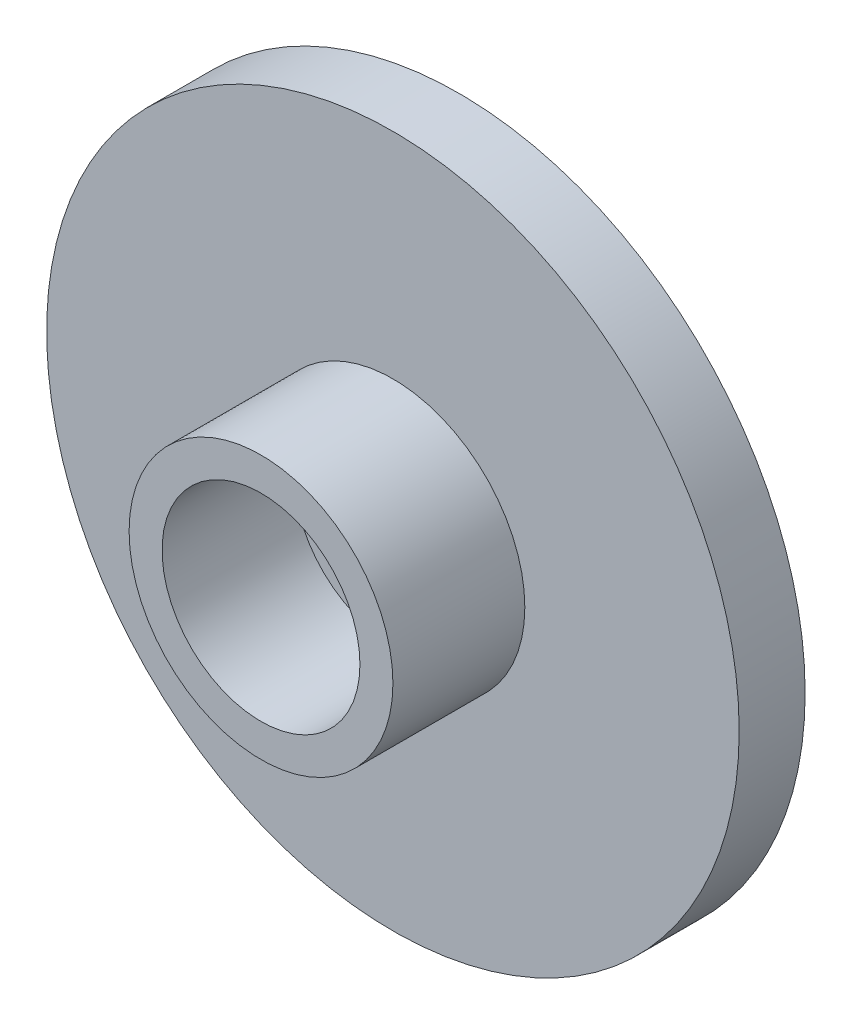
ISO-10303-21;
HEADER;
FILE_DESCRIPTION(('STEP AP214'),'2;1');
FILE_NAME('part.step','',(''),(''),'','','');
FILE_SCHEMA(('AUTOMOTIVE_DESIGN { 1 0 10303 214 1 1 1 1 }'));
ENDSEC;
DATA;
#1=APPLICATION_CONTEXT('core data for automotive mechanical design processes');
#2=APPLICATION_PROTOCOL_DEFINITION('international standard','automotive_design',2000,#1);
#3=PRODUCT_CONTEXT('',#1,'mechanical');
#4=PRODUCT('Part','Part','',(#3));
#5=PRODUCT_RELATED_PRODUCT_CATEGORY('part','',(#4));
#6=PRODUCT_DEFINITION_FORMATION('','',#4);
#7=PRODUCT_DEFINITION_CONTEXT('part definition',#1,'design');
#8=PRODUCT_DEFINITION('design','',#6,#7);
#9=PRODUCT_DEFINITION_SHAPE('','',#8);
#10=(LENGTH_UNIT() NAMED_UNIT(*) SI_UNIT(.MILLI.,.METRE.));
#11=(NAMED_UNIT(*) PLANE_ANGLE_UNIT() SI_UNIT($,.RADIAN.));
#12=(NAMED_UNIT(*) SI_UNIT($,.STERADIAN.) SOLID_ANGLE_UNIT());
#13=UNCERTAINTY_MEASURE_WITH_UNIT(LENGTH_MEASURE(1.E-05),#10,'distance_accuracy_value','');
#14=(GEOMETRIC_REPRESENTATION_CONTEXT(3) GLOBAL_UNCERTAINTY_ASSIGNED_CONTEXT((#13)) GLOBAL_UNIT_ASSIGNED_CONTEXT((#10,
#11,#12)) REPRESENTATION_CONTEXT('',''));
#15=CARTESIAN_POINT('',(0.,0.,0.));
#16=DIRECTION('',(0.,0.,1.));
#17=DIRECTION('',(1.,0.,0.));
#18=AXIS2_PLACEMENT_3D('',#15,#16,#17);
#19=CARTESIAN_POINT('',(0.,0.,0.));
#20=DIRECTION('',(0.,0.,1.));
#21=DIRECTION('',(1.,0.,0.));
#22=AXIS2_PLACEMENT_3D('',#19,#20,#21);
#23=CYLINDRICAL_SURFACE('',#22,10.5);
#24=CARTESIAN_POINT('',(0.,0.,0.));
#25=DIRECTION('',(0.,0.,1.));
#26=DIRECTION('',(1.,0.,0.));
#27=AXIS2_PLACEMENT_3D('',#24,#25,#26);
#28=CIRCLE('',#27,10.5);
#29=CARTESIAN_POINT('',(10.5,0.,0.));
#30=VERTEX_POINT('',#29);
#31=EDGE_CURVE('E10',#30,#30,#28,.T.);
#32=ORIENTED_EDGE('',*,*,#31,.T.);
#33=EDGE_LOOP('',(#32));
#34=FACE_BOUND('',#33,.T.);
#35=CARTESIAN_POINT('',(0.,0.,2.));
#36=DIRECTION('',(0.,0.,1.));
#37=DIRECTION('',(1.,0.,0.));
#38=AXIS2_PLACEMENT_3D('',#35,#36,#37);
#39=CIRCLE('',#38,10.5);
#40=CARTESIAN_POINT('',(10.5,0.,2.));
#41=VERTEX_POINT('',#40);
#42=EDGE_CURVE('E57',#41,#41,#39,.T.);
#43=ORIENTED_EDGE('',*,*,#42,.F.);
#44=EDGE_LOOP('',(#43));
#45=FACE_BOUND('',#44,.T.);
#46=ADVANCED_FACE('F35',(#34,#45),#23,.T.);
#47=CARTESIAN_POINT('',(10.5,0.,0.));
#48=DIRECTION('',(0.,0.,-1.));
#49=DIRECTION('',(-1.,0.,0.));
#50=AXIS2_PLACEMENT_3D('',#47,#48,#49);
#51=PLANE('',#50);
#52=ORIENTED_EDGE('',*,*,#31,.F.);
#53=EDGE_LOOP('',(#52));
#54=FACE_BOUND('',#53,.T.);
#55=ADVANCED_FACE('F65',(#54),#51,.T.);
#56=CARTESIAN_POINT('',(0.,0.,2.));
#57=DIRECTION('',(0.,0.,1.));
#58=DIRECTION('',(1.,0.,0.));
#59=AXIS2_PLACEMENT_3D('',#56,#57,#58);
#60=PLANE('',#59);
#61=CARTESIAN_POINT('',(0.,0.,2.));
#62=DIRECTION('',(0.,0.,1.));
#63=DIRECTION('',(1.,0.,0.));
#64=AXIS2_PLACEMENT_3D('',#61,#62,#63);
#65=CIRCLE('',#64,3.);
#66=CARTESIAN_POINT('',(3.,0.,2.));
#67=VERTEX_POINT('',#66);
#68=EDGE_CURVE('E41',#67,#67,#65,.T.);
#69=ORIENTED_EDGE('',*,*,#68,.T.);
#70=EDGE_LOOP('',(#69));
#71=FACE_BOUND('',#70,.T.);
#72=ADVANCED_FACE('F69',(#71),#60,.T.);
#73=CARTESIAN_POINT('',(0.,0.,0.));
#74=DIRECTION('',(0.,0.,1.));
#75=DIRECTION('',(1.,0.,0.));
#76=AXIS2_PLACEMENT_3D('',#73,#74,#75);
#77=CYLINDRICAL_SURFACE('',#76,3.);
#78=CARTESIAN_POINT('',(0.,0.,6.));
#79=DIRECTION('',(0.,0.,1.));
#80=DIRECTION('',(1.,0.,0.));
#81=AXIS2_PLACEMENT_3D('',#78,#79,#80);
#82=CIRCLE('',#81,3.);
#83=CARTESIAN_POINT('',(3.,0.,6.));
#84=VERTEX_POINT('',#83);
#85=EDGE_CURVE('E45',#84,#84,#82,.T.);
#86=ORIENTED_EDGE('',*,*,#85,.T.);
#87=EDGE_LOOP('',(#86));
#88=FACE_BOUND('',#87,.T.);
#89=ORIENTED_EDGE('',*,*,#68,.F.);
#90=EDGE_LOOP('',(#89));
#91=FACE_BOUND('',#90,.T.);
#92=ADVANCED_FACE('F74',(#88,#91),#77,.F.);
#93=CARTESIAN_POINT('',(3.,0.,6.));
#94=DIRECTION('',(0.,0.,1.));
#95=DIRECTION('',(1.,0.,0.));
#96=AXIS2_PLACEMENT_3D('',#93,#94,#95);
#97=PLANE('',#96);
#98=CARTESIAN_POINT('',(0.,0.,6.));
#99=DIRECTION('',(0.,0.,1.));
#100=DIRECTION('',(1.,0.,0.));
#101=AXIS2_PLACEMENT_3D('',#98,#99,#100);
#102=CIRCLE('',#101,4.);
#103=CARTESIAN_POINT('',(4.,0.,6.));
#104=VERTEX_POINT('',#103);
#105=EDGE_CURVE('E49',#104,#104,#102,.T.);
#106=ORIENTED_EDGE('',*,*,#105,.T.);
#107=EDGE_LOOP('',(#106));
#108=FACE_BOUND('',#107,.T.);
#109=ORIENTED_EDGE('',*,*,#85,.F.);
#110=EDGE_LOOP('',(#109));
#111=FACE_BOUND('',#110,.T.);
#112=ADVANCED_FACE('F79',(#108,#111),#97,.T.);
#113=CARTESIAN_POINT('',(0.,0.,0.));
#114=DIRECTION('',(0.,0.,1.));
#115=DIRECTION('',(1.,0.,0.));
#116=AXIS2_PLACEMENT_3D('',#113,#114,#115);
#117=CYLINDRICAL_SURFACE('',#116,4.);
#118=CARTESIAN_POINT('',(0.,0.,2.));
#119=DIRECTION('',(0.,0.,1.));
#120=DIRECTION('',(1.,0.,0.));
#121=AXIS2_PLACEMENT_3D('',#118,#119,#120);
#122=CIRCLE('',#121,4.);
#123=CARTESIAN_POINT('',(4.,0.,2.));
#124=VERTEX_POINT('',#123);
#125=EDGE_CURVE('E54',#124,#124,#122,.T.);
#126=ORIENTED_EDGE('',*,*,#125,.T.);
#127=EDGE_LOOP('',(#126));
#128=FACE_BOUND('',#127,.T.);
#129=ORIENTED_EDGE('',*,*,#105,.F.);
#130=EDGE_LOOP('',(#129));
#131=FACE_BOUND('',#130,.T.);
#132=ADVANCED_FACE('F83',(#128,#131),#117,.T.);
#133=CARTESIAN_POINT('',(4.,0.,2.));
#134=DIRECTION('',(0.,0.,1.));
#135=DIRECTION('',(1.,0.,0.));
#136=AXIS2_PLACEMENT_3D('',#133,#134,#135);
#137=PLANE('',#136);
#138=ORIENTED_EDGE('',*,*,#42,.T.);
#139=EDGE_LOOP('',(#138));
#140=FACE_BOUND('',#139,.T.);
#141=ORIENTED_EDGE('',*,*,#125,.F.);
#142=EDGE_LOOP('',(#141));
#143=FACE_BOUND('',#142,.T.);
#144=ADVANCED_FACE('F61',(#140,#143),#137,.T.);
#145=CLOSED_SHELL('',(#46,#55,#72,#92,#112,#132,#144));
#146=MANIFOLD_SOLID_BREP('B2',#145);
#147=ADVANCED_BREP_SHAPE_REPRESENTATION('',(#18,#146),#14);
#148=SHAPE_DEFINITION_REPRESENTATION(#9,#147);
ENDSEC;
END-ISO-10303-21;
